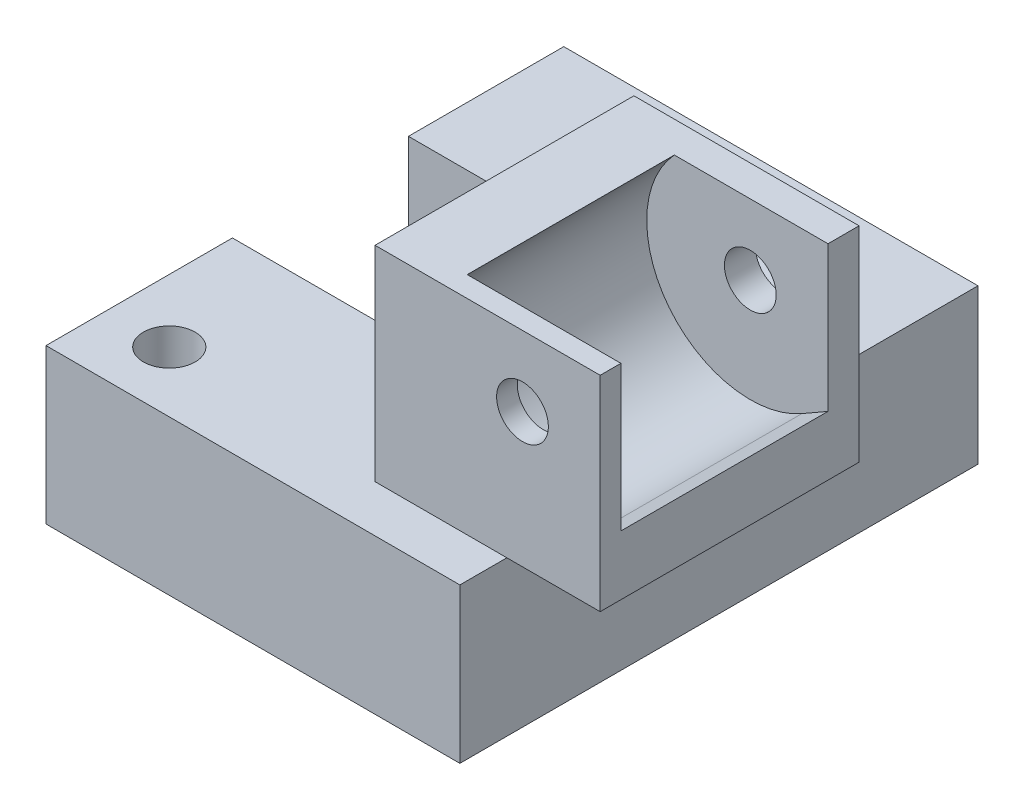
ISO-10303-21;
HEADER;
FILE_DESCRIPTION(('STEP AP214'),'2;1');
FILE_NAME('part.step','',(''),(''),'','','');
FILE_SCHEMA(('AUTOMOTIVE_DESIGN { 1 0 10303 214 1 1 1 1 }'));
ENDSEC;
DATA;
#1=APPLICATION_CONTEXT('core data for automotive mechanical design processes');
#2=APPLICATION_PROTOCOL_DEFINITION('international standard','automotive_design',2000,#1);
#3=PRODUCT_CONTEXT('',#1,'mechanical');
#4=PRODUCT('Part','Part','',(#3));
#5=PRODUCT_RELATED_PRODUCT_CATEGORY('part','',(#4));
#6=PRODUCT_DEFINITION_FORMATION('','',#4);
#7=PRODUCT_DEFINITION_CONTEXT('part definition',#1,'design');
#8=PRODUCT_DEFINITION('design','',#6,#7);
#9=PRODUCT_DEFINITION_SHAPE('','',#8);
#10=(LENGTH_UNIT() NAMED_UNIT(*) SI_UNIT(.MILLI.,.METRE.));
#11=(NAMED_UNIT(*) PLANE_ANGLE_UNIT() SI_UNIT($,.RADIAN.));
#12=(NAMED_UNIT(*) SI_UNIT($,.STERADIAN.) SOLID_ANGLE_UNIT());
#13=UNCERTAINTY_MEASURE_WITH_UNIT(LENGTH_MEASURE(1.E-05),#10,'distance_accuracy_value','');
#14=(GEOMETRIC_REPRESENTATION_CONTEXT(3) GLOBAL_UNCERTAINTY_ASSIGNED_CONTEXT((#13)) GLOBAL_UNIT_ASSIGNED_CONTEXT((#10,
#11,#12)) REPRESENTATION_CONTEXT('',''));
#15=CARTESIAN_POINT('',(0.,0.,0.));
#16=DIRECTION('',(0.,0.,1.));
#17=DIRECTION('',(1.,0.,0.));
#18=AXIS2_PLACEMENT_3D('',#15,#16,#17);
#19=CARTESIAN_POINT('',(-562.359793246241,223.218740039352,33.6602128680418));
#20=DIRECTION('',(-1.,0.,0.));
#21=DIRECTION('',(0.,-1.,0.));
#22=AXIS2_PLACEMENT_3D('',#19,#20,#21);
#23=PLANE('',#22);
#24=DIRECTION('',(0.,1.,0.));
#25=VECTOR('',#24,1.);
#26=CARTESIAN_POINT('',(-562.359793246241,304.5714,10.8002128680418));
#27=LINE('',#26,#25);
#28=CARTESIAN_POINT('',(-562.359793246241,304.5714,10.8002128680418));
#29=VERTEX_POINT('',#28);
#30=CARTESIAN_POINT('',(-562.359793246241,323.525975182462,10.8002128680418));
#31=VERTEX_POINT('',#30);
#32=EDGE_CURVE('E186',#29,#31,#27,.T.);
#33=ORIENTED_EDGE('',*,*,#32,.F.);
#34=DIRECTION('',(0.,0.,-1.));
#35=VECTOR('',#34,1.);
#36=CARTESIAN_POINT('',(-562.359793246241,304.5714,33.6602128680418));
#37=LINE('',#36,#35);
#38=CARTESIAN_POINT('',(-562.359793246241,304.5714,33.6602128680418));
#39=VERTEX_POINT('',#38);
#40=EDGE_CURVE('E185',#39,#29,#37,.T.);
#41=ORIENTED_EDGE('',*,*,#40,.F.);
#42=DIRECTION('',(0.,1.,0.));
#43=VECTOR('',#42,1.);
#44=CARTESIAN_POINT('',(-562.359793246241,223.218740039352,33.6602128680418));
#45=LINE('',#44,#43);
#46=CARTESIAN_POINT('',(-562.359793246241,323.525975182462,33.6602128680418));
#47=VERTEX_POINT('',#46);
#48=EDGE_CURVE('E227',#39,#47,#45,.T.);
#49=ORIENTED_EDGE('',*,*,#48,.T.);
#50=DIRECTION('',(0.,0.,-1.));
#51=VECTOR('',#50,1.);
#52=CARTESIAN_POINT('',(-562.359793246241,323.525975182462,33.6602128680418));
#53=LINE('',#52,#51);
#54=EDGE_CURVE('E204',#47,#31,#53,.T.);
#55=ORIENTED_EDGE('',*,*,#54,.T.);
#56=EDGE_LOOP('',(#33,#41,#49,#55));
#57=FACE_BOUND('',#56,.T.);
#58=ADVANCED_FACE('F43',(#57),#23,.T.);
#59=CARTESIAN_POINT('',(-509.64503003972,340.,27.94));
#60=DIRECTION('',(0.,0.,-1.));
#61=DIRECTION('',(1.,0.,0.));
#62=AXIS2_PLACEMENT_3D('',#59,#60,#61);
#63=CYLINDRICAL_SURFACE('',#62,12.7);
#64=CARTESIAN_POINT('',(-509.64503003972,340.,25.4000000000001));
#65=DIRECTION('',(0.,0.,-1.));
#66=DIRECTION('',(-1.,0.,0.));
#67=AXIS2_PLACEMENT_3D('',#64,#65,#66);
#68=CIRCLE('',#67,12.7);
#69=CARTESIAN_POINT('',(-503.315891549761,328.989459324133,25.4000000000001));
#70=VERTEX_POINT('',#69);
#71=CARTESIAN_POINT('',(-518.959059009132,348.633589309028,25.4000000000001));
#72=VERTEX_POINT('',#71);
#73=EDGE_CURVE('E268',#70,#72,#68,.T.);
#74=ORIENTED_EDGE('',*,*,#73,.F.);
#75=DIRECTION('',(0.,0.,-1.));
#76=VECTOR('',#75,1.);
#77=CARTESIAN_POINT('',(-503.315891549761,328.989459324133,27.94));
#78=LINE('',#77,#76);
#79=CARTESIAN_POINT('',(-503.315891549761,328.989459324133,0.));
#80=VERTEX_POINT('',#79);
#81=EDGE_CURVE('E52',#70,#80,#78,.T.);
#82=ORIENTED_EDGE('',*,*,#81,.T.);
#83=CARTESIAN_POINT('',(-509.64503003972,340.,0.));
#84=DIRECTION('',(0.,0.,1.));
#85=DIRECTION('',(1.,0.,0.));
#86=AXIS2_PLACEMENT_3D('',#83,#84,#85);
#87=CIRCLE('',#86,12.7);
#88=CARTESIAN_POINT('',(-518.959059009132,348.633589309028,0.));
#89=VERTEX_POINT('',#88);
#90=EDGE_CURVE('E279',#89,#80,#87,.T.);
#91=ORIENTED_EDGE('',*,*,#90,.F.);
#92=DIRECTION('',(0.,0.,-1.));
#93=VECTOR('',#92,1.);
#94=CARTESIAN_POINT('',(-518.959059009132,348.633589309028,27.94));
#95=LINE('',#94,#93);
#96=EDGE_CURVE('E47',#72,#89,#95,.T.);
#97=ORIENTED_EDGE('',*,*,#96,.F.);
#98=EDGE_LOOP('',(#74,#82,#91,#97));
#99=FACE_BOUND('',#98,.T.);
#100=ADVANCED_FACE('F45',(#99),#63,.F.);
#101=CARTESIAN_POINT('',(-267.1473205328,464.745153521614,27.94));
#102=DIRECTION('',(-0.498357361414056,0.866971706761195,0.));
#103=DIRECTION('',(-0.866971706761195,-0.498357361414056,0.));
#104=AXIS2_PLACEMENT_3D('',#101,#102,#103);
#105=PLANE('',#104);
#106=DIRECTION('',(0.,0.,-1.));
#107=VECTOR('',#106,1.);
#108=CARTESIAN_POINT('',(-500.115803520306,330.82895121783,27.94));
#109=LINE('',#108,#107);
#110=CARTESIAN_POINT('',(-500.115803520306,330.82895121783,25.4000000000001));
#111=VERTEX_POINT('',#110);
#112=CARTESIAN_POINT('',(-500.115803520306,330.82895121783,0.));
#113=VERTEX_POINT('',#112);
#114=EDGE_CURVE('E298',#111,#113,#109,.T.);
#115=ORIENTED_EDGE('',*,*,#114,.T.);
#116=DIRECTION('',(-0.866971706761195,-0.498357361414056,0.));
#117=VECTOR('',#116,1.);
#118=CARTESIAN_POINT('',(-267.1473205328,464.745153521614,0.));
#119=LINE('',#118,#117);
#120=EDGE_CURVE('E283',#113,#80,#119,.T.);
#121=ORIENTED_EDGE('',*,*,#120,.T.);
#122=ORIENTED_EDGE('',*,*,#81,.F.);
#123=DIRECTION('',(-0.866971706761204,-0.498357361414042,0.));
#124=VECTOR('',#123,1.);
#125=CARTESIAN_POINT('',(-500.115803520306,330.82895121783,25.4000000000001));
#126=LINE('',#125,#124);
#127=EDGE_CURVE('E271',#111,#70,#126,.T.);
#128=ORIENTED_EDGE('',*,*,#127,.F.);
#129=EDGE_LOOP('',(#115,#121,#122,#128));
#130=FACE_BOUND('',#129,.T.);
#131=ADVANCED_FACE('F350',(#130),#105,.T.);
#132=CARTESIAN_POINT('',(-500.115803520306,0.,27.94));
#133=DIRECTION('',(-1.,0.,0.));
#134=DIRECTION('',(0.,0.,-1.));
#135=AXIS2_PLACEMENT_3D('',#132,#133,#134);
#136=PLANE('',#135);
#137=ORIENTED_EDGE('',*,*,#114,.F.);
#138=DIRECTION('',(0.,-1.,0.));
#139=VECTOR('',#138,1.);
#140=CARTESIAN_POINT('',(-500.115803520306,330.82895121783,25.4000000000001));
#141=LINE('',#140,#139);
#142=CARTESIAN_POINT('',(-500.115803520306,348.633589309028,25.4000000000001));
#143=VERTEX_POINT('',#142);
#144=EDGE_CURVE('E262',#143,#111,#141,.T.);
#145=ORIENTED_EDGE('',*,*,#144,.F.);
#146=DIRECTION('',(0.,0.,-1.));
#147=VECTOR('',#146,1.);
#148=CARTESIAN_POINT('',(-500.115803520306,348.633589309028,58.7500721267847));
#149=LINE('',#148,#147);
#150=CARTESIAN_POINT('',(-500.115803520306,348.633589309028,27.94));
#151=VERTEX_POINT('',#150);
#152=EDGE_CURVE('E265',#151,#143,#149,.T.);
#153=ORIENTED_EDGE('',*,*,#152,.F.);
#154=DIRECTION('',(0.,-1.,0.));
#155=VECTOR('',#154,1.);
#156=CARTESIAN_POINT('',(-500.115803520306,0.,27.94));
#157=LINE('',#156,#155);
#158=CARTESIAN_POINT('',(-500.115803520306,323.525975182462,27.94));
#159=VERTEX_POINT('',#158);
#160=EDGE_CURVE('E290',#151,#159,#157,.T.);
#161=ORIENTED_EDGE('',*,*,#160,.T.);
#162=DIRECTION('',(0.,0.,-1.));
#163=VECTOR('',#162,1.);
#164=CARTESIAN_POINT('',(-500.115803520306,323.525975182462,27.94));
#165=LINE('',#164,#163);
#166=CARTESIAN_POINT('',(-500.115803520306,323.525975182462,-3.81));
#167=VERTEX_POINT('',#166);
#168=EDGE_CURVE('E301',#159,#167,#165,.T.);
#169=ORIENTED_EDGE('',*,*,#168,.T.);
#170=DIRECTION('',(0.,-1.,0.));
#171=VECTOR('',#170,1.);
#172=CARTESIAN_POINT('',(-500.115803520306,348.633589309028,-3.81));
#173=LINE('',#172,#171);
#174=CARTESIAN_POINT('',(-500.115803520306,348.633589309028,-3.81));
#175=VERTEX_POINT('',#174);
#176=EDGE_CURVE('E252',#175,#167,#173,.T.);
#177=ORIENTED_EDGE('',*,*,#176,.F.);
#178=DIRECTION('',(0.,0.,1.));
#179=VECTOR('',#178,1.);
#180=CARTESIAN_POINT('',(-500.115803520306,348.633589309028,-3.81));
#181=LINE('',#180,#179);
#182=CARTESIAN_POINT('',(-500.115803520306,348.633589309028,0.));
#183=VERTEX_POINT('',#182);
#184=EDGE_CURVE('E255',#175,#183,#181,.T.);
#185=ORIENTED_EDGE('',*,*,#184,.T.);
#186=DIRECTION('',(0.,-1.,0.));
#187=VECTOR('',#186,1.);
#188=CARTESIAN_POINT('',(-500.115803520306,348.633589309028,0.));
#189=LINE('',#188,#187);
#190=EDGE_CURVE('E257',#183,#113,#189,.T.);
#191=ORIENTED_EDGE('',*,*,#190,.T.);
#192=EDGE_LOOP('',(#137,#145,#153,#161,#169,#177,#185,#191));
#193=FACE_BOUND('',#192,.T.);
#194=ADVANCED_FACE('F327',(#193),#136,.F.);
#195=CARTESIAN_POINT('',(0.,323.525975182462,27.94));
#196=DIRECTION('',(0.,1.,0.));
#197=DIRECTION('',(0.,0.,-1.));
#198=AXIS2_PLACEMENT_3D('',#195,#196,#197);
#199=PLANE('',#198);
#200=DIRECTION('',(-1.,0.,0.));
#201=VECTOR('',#200,1.);
#202=CARTESIAN_POINT('',(-500.115803520306,323.525975182462,-3.81));
#203=LINE('',#202,#201);
#204=CARTESIAN_POINT('',(-511.559800437477,323.525975182462,-3.81000000000003));
#205=VERTEX_POINT('',#204);
#206=EDGE_CURVE('E243',#167,#205,#203,.T.);
#207=ORIENTED_EDGE('',*,*,#206,.F.);
#208=ORIENTED_EDGE('',*,*,#168,.F.);
#209=DIRECTION('',(-1.,0.,0.));
#210=VECTOR('',#209,1.);
#211=CARTESIAN_POINT('',(0.,323.525975182462,27.94));
#212=LINE('',#211,#210);
#213=CARTESIAN_POINT('',(-511.559809209032,323.525975182462,27.94));
#214=VERTEX_POINT('',#213);
#215=EDGE_CURVE('E287',#159,#214,#212,.T.);
#216=ORIENTED_EDGE('',*,*,#215,.T.);
#217=DIRECTION('',(-2.76269463312672E-07,0.,0.999999999999962));
#218=VECTOR('',#217,1.);
#219=CARTESIAN_POINT('',(-511.55981080102,323.525975182462,33.7024451444806));
#220=LINE('',#219,#218);
#221=EDGE_CURVE('E11',#205,#214,#220,.T.);
#222=ORIENTED_EDGE('',*,*,#221,.F.);
#223=EDGE_LOOP('',(#207,#208,#216,#222));
#224=FACE_BOUND('',#223,.T.);
#225=ADVANCED_FACE('F357',(#224),#199,.F.);
#226=CARTESIAN_POINT('',(-527.727560082314,0.,27.94));
#227=DIRECTION('',(1.,0.,0.));
#228=DIRECTION('',(0.,0.,1.));
#229=AXIS2_PLACEMENT_3D('',#226,#227,#228);
#230=PLANE('',#229);
#231=DIRECTION('',(0.,0.,-1.));
#232=VECTOR('',#231,1.);
#233=CARTESIAN_POINT('',(-527.727560082314,323.525975182462,27.94));
#234=LINE('',#233,#232);
#235=CARTESIAN_POINT('',(-527.727560082314,323.525975182462,27.94));
#236=VERTEX_POINT('',#235);
#237=CARTESIAN_POINT('',(-527.727560082314,323.525975182462,-3.81));
#238=VERTEX_POINT('',#237);
#239=EDGE_CURVE('E304',#236,#238,#234,.T.);
#240=ORIENTED_EDGE('',*,*,#239,.F.);
#241=DIRECTION('',(0.,1.,0.));
#242=VECTOR('',#241,1.);
#243=CARTESIAN_POINT('',(-527.727560082314,0.,27.94));
#244=LINE('',#243,#242);
#245=CARTESIAN_POINT('',(-527.727560082314,348.633589309028,27.94));
#246=VERTEX_POINT('',#245);
#247=EDGE_CURVE('E282',#236,#246,#244,.T.);
#248=ORIENTED_EDGE('',*,*,#247,.T.);
#249=DIRECTION('',(0.,0.,-1.));
#250=VECTOR('',#249,1.);
#251=CARTESIAN_POINT('',(-527.727560082314,348.633589309028,27.94));
#252=LINE('',#251,#250);
#253=CARTESIAN_POINT('',(-527.727560082314,348.633589309028,-3.81));
#254=VERTEX_POINT('',#253);
#255=EDGE_CURVE('E306',#246,#254,#252,.T.);
#256=ORIENTED_EDGE('',*,*,#255,.T.);
#257=DIRECTION('',(0.,1.,0.));
#258=VECTOR('',#257,1.);
#259=CARTESIAN_POINT('',(-527.727560082314,323.525975182462,-3.81));
#260=LINE('',#259,#258);
#261=EDGE_CURVE('E246',#238,#254,#260,.T.);
#262=ORIENTED_EDGE('',*,*,#261,.F.);
#263=EDGE_LOOP('',(#240,#248,#256,#262));
#264=FACE_BOUND('',#263,.T.);
#265=ADVANCED_FACE('F333',(#264),#230,.F.);
#266=CARTESIAN_POINT('',(-7.00898976020188E-13,348.633589309029,27.94));
#267=DIRECTION('',(0.,-1.,0.));
#268=DIRECTION('',(1.,0.,0.));
#269=AXIS2_PLACEMENT_3D('',#266,#267,#268);
#270=PLANE('',#269);
#271=ORIENTED_EDGE('',*,*,#255,.F.);
#272=DIRECTION('',(1.,0.,0.));
#273=VECTOR('',#272,1.);
#274=CARTESIAN_POINT('',(-7.00898976020188E-13,348.633589309029,27.94));
#275=LINE('',#274,#273);
#276=EDGE_CURVE('E280',#246,#151,#275,.T.);
#277=ORIENTED_EDGE('',*,*,#276,.T.);
#278=ORIENTED_EDGE('',*,*,#152,.T.);
#279=DIRECTION('',(1.,0.,0.));
#280=VECTOR('',#279,1.);
#281=CARTESIAN_POINT('',(-500.115803520306,348.633589309028,25.4000000000001));
#282=LINE('',#281,#280);
#283=EDGE_CURVE('E266',#72,#143,#282,.T.);
#284=ORIENTED_EDGE('',*,*,#283,.F.);
#285=ORIENTED_EDGE('',*,*,#96,.T.);
#286=DIRECTION('',(1.,0.,0.));
#287=VECTOR('',#286,1.);
#288=CARTESIAN_POINT('',(-527.727560082314,348.633589309028,0.));
#289=LINE('',#288,#287);
#290=EDGE_CURVE('E240',#89,#183,#289,.T.);
#291=ORIENTED_EDGE('',*,*,#290,.T.);
#292=ORIENTED_EDGE('',*,*,#184,.F.);
#293=DIRECTION('',(1.,0.,0.));
#294=VECTOR('',#293,1.);
#295=CARTESIAN_POINT('',(-527.727560082314,348.633589309028,-3.81));
#296=LINE('',#295,#294);
#297=EDGE_CURVE('E250',#254,#175,#296,.T.);
#298=ORIENTED_EDGE('',*,*,#297,.F.);
#299=EDGE_LOOP('',(#271,#277,#278,#284,#285,#291,#292,#298));
#300=FACE_BOUND('',#299,.T.);
#301=ADVANCED_FACE('F315',(#300),#270,.F.);
#302=CARTESIAN_POINT('',(0.,0.,27.94));
#303=DIRECTION('',(0.,0.,-1.));
#304=DIRECTION('',(1.,0.,0.));
#305=AXIS2_PLACEMENT_3D('',#302,#303,#304);
#306=PLANE('',#305);
#307=ORIENTED_EDGE('',*,*,#276,.F.);
#308=ORIENTED_EDGE('',*,*,#247,.F.);
#309=EDGE_CURVE('E286',#214,#236,#212,.T.);
#310=ORIENTED_EDGE('',*,*,#309,.F.);
#311=ORIENTED_EDGE('',*,*,#215,.F.);
#312=ORIENTED_EDGE('',*,*,#160,.F.);
#313=EDGE_LOOP('',(#307,#308,#310,#311,#312));
#314=FACE_BOUND('',#313,.T.);
#315=CARTESIAN_POINT('',(-509.64503003972,340.,27.94));
#316=DIRECTION('',(0.,0.,1.));
#317=DIRECTION('',(1.,0.,0.));
#318=AXIS2_PLACEMENT_3D('',#315,#316,#317);
#319=CIRCLE('',#318,3.1750000000002);
#320=CARTESIAN_POINT('',(-506.47003003972,340.,27.94));
#321=VERTEX_POINT('',#320);
#322=EDGE_CURVE('E264',#321,#321,#319,.T.);
#323=ORIENTED_EDGE('',*,*,#322,.F.);
#324=EDGE_LOOP('',(#323));
#325=FACE_BOUND('',#324,.T.);
#326=ADVANCED_FACE('F340',(#314,#325),#306,.F.);
#327=CARTESIAN_POINT('',(-509.64503003972,340.,25.4000000000001));
#328=DIRECTION('',(0.,0.,1.));
#329=DIRECTION('',(-1.,0.,0.));
#330=AXIS2_PLACEMENT_3D('',#327,#328,#329);
#331=PLANE('',#330);
#332=ORIENTED_EDGE('',*,*,#127,.T.);
#333=ORIENTED_EDGE('',*,*,#73,.T.);
#334=ORIENTED_EDGE('',*,*,#283,.T.);
#335=ORIENTED_EDGE('',*,*,#144,.T.);
#336=EDGE_LOOP('',(#332,#333,#334,#335));
#337=FACE_BOUND('',#336,.T.);
#338=CARTESIAN_POINT('',(-509.64503003972,340.,25.4000000000001));
#339=DIRECTION('',(0.,0.,-1.));
#340=DIRECTION('',(-1.,0.,0.));
#341=AXIS2_PLACEMENT_3D('',#338,#339,#340);
#342=CIRCLE('',#341,3.1750000000002);
#343=CARTESIAN_POINT('',(-512.82003003972,340.,25.4000000000001));
#344=VERTEX_POINT('',#343);
#345=EDGE_CURVE('E261',#344,#344,#342,.T.);
#346=ORIENTED_EDGE('',*,*,#345,.F.);
#347=EDGE_LOOP('',(#346));
#348=FACE_BOUND('',#347,.T.);
#349=ADVANCED_FACE('F347',(#337,#348),#331,.F.);
#350=CARTESIAN_POINT('',(-509.64503003972,340.,58.7500721267847));
#351=DIRECTION('',(0.,0.,-1.));
#352=DIRECTION('',(1.,0.,0.));
#353=AXIS2_PLACEMENT_3D('',#350,#351,#352);
#354=CYLINDRICAL_SURFACE('',#353,3.1750000000002);
#355=ORIENTED_EDGE('',*,*,#322,.T.);
#356=EDGE_LOOP('',(#355));
#357=FACE_BOUND('',#356,.T.);
#358=ORIENTED_EDGE('',*,*,#345,.T.);
#359=EDGE_LOOP('',(#358));
#360=FACE_BOUND('',#359,.T.);
#361=ADVANCED_FACE('F390',(#357,#360),#354,.F.);
#362=CARTESIAN_POINT('',(0.,0.,0.));
#363=DIRECTION('',(0.,0.,1.));
#364=DIRECTION('',(-1.,0.,0.));
#365=AXIS2_PLACEMENT_3D('',#362,#363,#364);
#366=PLANE('',#365);
#367=CARTESIAN_POINT('',(-509.64503003972,340.,0.));
#368=DIRECTION('',(0.,0.,1.));
#369=DIRECTION('',(1.,0.,0.));
#370=AXIS2_PLACEMENT_3D('',#367,#368,#369);
#371=CIRCLE('',#370,3.17500000000009);
#372=CARTESIAN_POINT('',(-506.47003003972,340.,0.));
#373=VERTEX_POINT('',#372);
#374=EDGE_CURVE('E218',#373,#373,#371,.T.);
#375=ORIENTED_EDGE('',*,*,#374,.F.);
#376=EDGE_LOOP('',(#375));
#377=FACE_BOUND('',#376,.T.);
#378=ORIENTED_EDGE('',*,*,#90,.T.);
#379=ORIENTED_EDGE('',*,*,#120,.F.);
#380=ORIENTED_EDGE('',*,*,#190,.F.);
#381=ORIENTED_EDGE('',*,*,#290,.F.);
#382=EDGE_LOOP('',(#378,#379,#380,#381));
#383=FACE_BOUND('',#382,.T.);
#384=ADVANCED_FACE('F323',(#377,#383),#366,.T.);
#385=CARTESIAN_POINT('',(0.,0.,-3.81));
#386=DIRECTION('',(0.,0.,1.));
#387=DIRECTION('',(-1.,0.,0.));
#388=AXIS2_PLACEMENT_3D('',#385,#386,#387);
#389=PLANE('',#388);
#390=ORIENTED_EDGE('',*,*,#206,.T.);
#391=EDGE_CURVE('E247',#205,#238,#203,.T.);
#392=ORIENTED_EDGE('',*,*,#391,.T.);
#393=ORIENTED_EDGE('',*,*,#261,.T.);
#394=ORIENTED_EDGE('',*,*,#297,.T.);
#395=ORIENTED_EDGE('',*,*,#176,.T.);
#396=EDGE_LOOP('',(#390,#392,#393,#394,#395));
#397=FACE_BOUND('',#396,.T.);
#398=CARTESIAN_POINT('',(-509.64503003972,340.,-3.81));
#399=DIRECTION('',(0.,0.,1.));
#400=DIRECTION('',(1.,0.,0.));
#401=AXIS2_PLACEMENT_3D('',#398,#399,#400);
#402=CIRCLE('',#401,3.17500000000009);
#403=CARTESIAN_POINT('',(-506.47003003972,340.,-3.81));
#404=VERTEX_POINT('',#403);
#405=EDGE_CURVE('E237',#404,#404,#402,.T.);
#406=ORIENTED_EDGE('',*,*,#405,.T.);
#407=EDGE_LOOP('',(#406));
#408=FACE_BOUND('',#407,.T.);
#409=ADVANCED_FACE('F329',(#397,#408),#389,.F.);
#410=CARTESIAN_POINT('',(-509.64503003972,340.,-3.81));
#411=DIRECTION('',(0.,0.,1.));
#412=DIRECTION('',(-1.,0.,0.));
#413=AXIS2_PLACEMENT_3D('',#410,#411,#412);
#414=CYLINDRICAL_SURFACE('',#413,3.17500000000009);
#415=ORIENTED_EDGE('',*,*,#405,.F.);
#416=EDGE_LOOP('',(#415));
#417=FACE_BOUND('',#416,.T.);
#418=ORIENTED_EDGE('',*,*,#374,.T.);
#419=EDGE_LOOP('',(#418));
#420=FACE_BOUND('',#419,.T.);
#421=ADVANCED_FACE('F370',(#417,#420),#414,.F.);
#422=DIRECTION('',(0.,1.,0.));
#423=VECTOR('',#422,1.);
#424=CARTESIAN_POINT('',(-562.359793246241,304.5714,-10.7897871319582));
#425=LINE('',#424,#423);
#426=CARTESIAN_POINT('',(-562.359793246241,304.5714,-10.7897871319582));
#427=VERTEX_POINT('',#426);
#428=CARTESIAN_POINT('',(-562.359793246241,323.525975182462,-10.7897871319582));
#429=VERTEX_POINT('',#428);
#430=EDGE_CURVE('E182',#427,#429,#425,.T.);
#431=ORIENTED_EDGE('',*,*,#430,.T.);
#432=CARTESIAN_POINT('',(-562.359793246241,323.525975182462,-29.8397871319582));
#433=VERTEX_POINT('',#432);
#434=EDGE_CURVE('E207',#429,#433,#53,.T.);
#435=ORIENTED_EDGE('',*,*,#434,.T.);
#436=DIRECTION('',(0.,1.,0.));
#437=VECTOR('',#436,1.);
#438=CARTESIAN_POINT('',(-562.359793246241,223.218740039352,-29.8397871319582));
#439=LINE('',#438,#437);
#440=CARTESIAN_POINT('',(-562.359793246241,304.5714,-29.8397871319582));
#441=VERTEX_POINT('',#440);
#442=EDGE_CURVE('E184',#441,#433,#439,.T.);
#443=ORIENTED_EDGE('',*,*,#442,.F.);
#444=EDGE_CURVE('E171',#427,#441,#37,.T.);
#445=ORIENTED_EDGE('',*,*,#444,.F.);
#446=EDGE_LOOP('',(#431,#435,#443,#445));
#447=FACE_BOUND('',#446,.T.);
#448=ADVANCED_FACE('F180',(#447),#23,.T.);
#449=CARTESIAN_POINT('',(-562.359793246241,223.218740039352,33.6602128680418));
#450=DIRECTION('',(-0.000831344024384845,0.,0.999999654433497));
#451=DIRECTION('',(-0.999999654433497,0.,-0.000831344024384845));
#452=AXIS2_PLACEMENT_3D('',#449,#450,#451);
#453=PLANE('',#452);
#454=DIRECTION('',(0.,1.,0.));
#455=VECTOR('',#454,1.);
#456=CARTESIAN_POINT('',(-511.55981080102,223.218740039352,33.7024451444805));
#457=LINE('',#456,#455);
#458=CARTESIAN_POINT('',(-511.55981080102,304.5714,33.7024451444806));
#459=VERTEX_POINT('',#458);
#460=CARTESIAN_POINT('',(-511.55981080102,323.525975182462,33.7024451444806));
#461=VERTEX_POINT('',#460);
#462=EDGE_CURVE('E222',#459,#461,#457,.T.);
#463=ORIENTED_EDGE('',*,*,#462,.T.);
#464=DIRECTION('',(-0.999999654433497,0.,-0.000831344024384845));
#465=VECTOR('',#464,1.);
#466=CARTESIAN_POINT('',(-562.359793246241,323.525975182462,33.6602128680418));
#467=LINE('',#466,#465);
#468=EDGE_CURVE('E199',#461,#47,#467,.T.);
#469=ORIENTED_EDGE('',*,*,#468,.T.);
#470=ORIENTED_EDGE('',*,*,#48,.F.);
#471=DIRECTION('',(-0.999999654433497,0.,-0.000831344024384845));
#472=VECTOR('',#471,1.);
#473=CARTESIAN_POINT('',(-562.359793246241,304.5714,33.6602128680418));
#474=LINE('',#473,#472);
#475=EDGE_CURVE('E225',#459,#39,#474,.T.);
#476=ORIENTED_EDGE('',*,*,#475,.F.);
#477=EDGE_LOOP('',(#463,#469,#470,#476));
#478=FACE_BOUND('',#477,.T.);
#479=ADVANCED_FACE('F369',(#478),#453,.T.);
#480=CARTESIAN_POINT('',(-511.55981080102,223.218740039352,33.7024451444805));
#481=DIRECTION('',(0.999999999999962,0.,2.76269463312672E-07));
#482=DIRECTION('',(-2.76269463312672E-07,0.,0.999999999999962));
#483=AXIS2_PLACEMENT_3D('',#480,#481,#482);
#484=PLANE('',#483);
#485=DIRECTION('',(0.,1.,0.));
#486=VECTOR('',#485,1.);
#487=CARTESIAN_POINT('',(-511.559793246241,223.218740039352,-29.8397871319582));
#488=LINE('',#487,#486);
#489=CARTESIAN_POINT('',(-511.559793246241,304.5714,-29.8397871319582));
#490=VERTEX_POINT('',#489);
#491=CARTESIAN_POINT('',(-511.559793246241,323.525975182462,-29.8397871319582));
#492=VERTEX_POINT('',#491);
#493=EDGE_CURVE('E212',#490,#492,#488,.T.);
#494=ORIENTED_EDGE('',*,*,#493,.T.);
#495=EDGE_CURVE('E54',#492,#205,#220,.T.);
#496=ORIENTED_EDGE('',*,*,#495,.T.);
#497=ORIENTED_EDGE('',*,*,#221,.T.);
#498=EDGE_CURVE('E55',#214,#461,#220,.T.);
#499=ORIENTED_EDGE('',*,*,#498,.T.);
#500=ORIENTED_EDGE('',*,*,#462,.F.);
#501=DIRECTION('',(-2.76269463312672E-07,0.,0.999999999999962));
#502=VECTOR('',#501,1.);
#503=CARTESIAN_POINT('',(-511.55981080102,304.5714,33.7024451444806));
#504=LINE('',#503,#502);
#505=EDGE_CURVE('E228',#490,#459,#504,.T.);
#506=ORIENTED_EDGE('',*,*,#505,.F.);
#507=EDGE_LOOP('',(#494,#496,#497,#499,#500,#506));
#508=FACE_BOUND('',#507,.T.);
#509=ADVANCED_FACE('F375',(#508),#484,.T.);
#510=CARTESIAN_POINT('',(-562.359793246241,223.218740039352,-29.8397871319582));
#511=DIRECTION('',(0.,0.,-1.));
#512=DIRECTION('',(0.,-1.,0.));
#513=AXIS2_PLACEMENT_3D('',#510,#511,#512);
#514=PLANE('',#513);
#515=ORIENTED_EDGE('',*,*,#442,.T.);
#516=DIRECTION('',(1.,0.,0.));
#517=VECTOR('',#516,1.);
#518=CARTESIAN_POINT('',(-562.359793246241,323.525975182462,-29.8397871319582));
#519=LINE('',#518,#517);
#520=EDGE_CURVE('E202',#433,#492,#519,.T.);
#521=ORIENTED_EDGE('',*,*,#520,.T.);
#522=ORIENTED_EDGE('',*,*,#493,.F.);
#523=DIRECTION('',(1.,0.,0.));
#524=VECTOR('',#523,1.);
#525=CARTESIAN_POINT('',(-562.359793246241,304.5714,-29.8397871319582));
#526=LINE('',#525,#524);
#527=EDGE_CURVE('E221',#441,#490,#526,.T.);
#528=ORIENTED_EDGE('',*,*,#527,.F.);
#529=EDGE_LOOP('',(#515,#521,#522,#528));
#530=FACE_BOUND('',#529,.T.);
#531=ADVANCED_FACE('F415',(#530),#514,.T.);
#532=CARTESIAN_POINT('',(-539.269132339574,223.218740039352,-22.1596399352954));
#533=DIRECTION('',(0.,1.,0.));
#534=DIRECTION('',(0.,0.,-1.));
#535=AXIS2_PLACEMENT_3D('',#532,#533,#534);
#536=CYLINDRICAL_SURFACE('',#535,3.17500000000008);
#537=CARTESIAN_POINT('',(-539.269132339574,323.525975182462,-22.1596399352954));
#538=DIRECTION('',(0.,-1.,0.));
#539=DIRECTION('',(0.,0.,-1.));
#540=AXIS2_PLACEMENT_3D('',#537,#538,#539);
#541=CIRCLE('',#540,3.17500000000008);
#542=CARTESIAN_POINT('',(-539.269132339574,323.525975182462,-25.3346399352955));
#543=VERTEX_POINT('',#542);
#544=EDGE_CURVE('E208',#543,#543,#541,.T.);
#545=ORIENTED_EDGE('',*,*,#544,.F.);
#546=EDGE_LOOP('',(#545));
#547=FACE_BOUND('',#546,.T.);
#548=CARTESIAN_POINT('',(-539.269132339574,304.5714,-22.1596399352954));
#549=DIRECTION('',(0.,1.,0.));
#550=DIRECTION('',(0.,0.,1.));
#551=AXIS2_PLACEMENT_3D('',#548,#549,#550);
#552=CIRCLE('',#551,3.17500000000008);
#553=CARTESIAN_POINT('',(-539.269132339574,304.5714,-18.9846399352953));
#554=VERTEX_POINT('',#553);
#555=EDGE_CURVE('E215',#554,#554,#552,.F.);
#556=ORIENTED_EDGE('',*,*,#555,.T.);
#557=EDGE_LOOP('',(#556));
#558=FACE_BOUND('',#557,.T.);
#559=ADVANCED_FACE('F447',(#547,#558),#536,.F.);
#560=CARTESIAN_POINT('',(-554.645069673997,223.218740039352,26.2575114791356));
#561=DIRECTION('',(0.,1.,0.));
#562=DIRECTION('',(0.,0.,-1.));
#563=AXIS2_PLACEMENT_3D('',#560,#561,#562);
#564=CYLINDRICAL_SURFACE('',#563,3.17500000000008);
#565=CARTESIAN_POINT('',(-554.645069673997,323.525975182462,26.2575114791357));
#566=DIRECTION('',(0.,-1.,0.));
#567=DIRECTION('',(0.,0.,-1.));
#568=AXIS2_PLACEMENT_3D('',#565,#566,#567);
#569=CIRCLE('',#568,3.17500000000008);
#570=CARTESIAN_POINT('',(-554.645069673997,323.525975182462,23.0825114791356));
#571=VERTEX_POINT('',#570);
#572=EDGE_CURVE('E211',#571,#571,#569,.T.);
#573=ORIENTED_EDGE('',*,*,#572,.F.);
#574=EDGE_LOOP('',(#573));
#575=FACE_BOUND('',#574,.T.);
#576=CARTESIAN_POINT('',(-554.645069673997,304.5714,26.2575114791357));
#577=DIRECTION('',(0.,1.,0.));
#578=DIRECTION('',(0.,0.,1.));
#579=AXIS2_PLACEMENT_3D('',#576,#577,#578);
#580=CIRCLE('',#579,3.17500000000008);
#581=CARTESIAN_POINT('',(-554.645069673997,304.5714,29.4325114791357));
#582=VERTEX_POINT('',#581);
#583=EDGE_CURVE('E200',#582,#582,#580,.F.);
#584=ORIENTED_EDGE('',*,*,#583,.T.);
#585=EDGE_LOOP('',(#584));
#586=FACE_BOUND('',#585,.T.);
#587=ADVANCED_FACE('F444',(#575,#586),#564,.F.);
#588=CARTESIAN_POINT('',(0.,323.525975182462,0.));
#589=DIRECTION('',(0.,1.,0.));
#590=DIRECTION('',(0.,0.,-1.));
#591=AXIS2_PLACEMENT_3D('',#588,#589,#590);
#592=PLANE('',#591);
#593=DIRECTION('',(-1.,0.,0.));
#594=VECTOR('',#593,1.);
#595=CARTESIAN_POINT('',(-562.359793246241,323.525975182462,10.8002128680418));
#596=LINE('',#595,#594);
#597=CARTESIAN_POINT('',(-539.499793246241,323.525975182462,10.8002128680418));
#598=VERTEX_POINT('',#597);
#599=EDGE_CURVE('E176',#598,#31,#596,.T.);
#600=ORIENTED_EDGE('',*,*,#599,.T.);
#601=ORIENTED_EDGE('',*,*,#54,.F.);
#602=ORIENTED_EDGE('',*,*,#468,.F.);
#603=ORIENTED_EDGE('',*,*,#498,.F.);
#604=ORIENTED_EDGE('',*,*,#309,.T.);
#605=ORIENTED_EDGE('',*,*,#239,.T.);
#606=ORIENTED_EDGE('',*,*,#391,.F.);
#607=ORIENTED_EDGE('',*,*,#495,.F.);
#608=ORIENTED_EDGE('',*,*,#520,.F.);
#609=ORIENTED_EDGE('',*,*,#434,.F.);
#610=DIRECTION('',(1.,0.,0.));
#611=VECTOR('',#610,1.);
#612=CARTESIAN_POINT('',(-539.499793246241,323.525975182462,-10.7897871319582));
#613=LINE('',#612,#611);
#614=CARTESIAN_POINT('',(-539.499793246241,323.525975182462,-10.7897871319582));
#615=VERTEX_POINT('',#614);
#616=EDGE_CURVE('E190',#429,#615,#613,.T.);
#617=ORIENTED_EDGE('',*,*,#616,.T.);
#618=DIRECTION('',(0.,0.,1.));
#619=VECTOR('',#618,1.);
#620=CARTESIAN_POINT('',(-539.499793246241,323.525975182462,10.8002128680418));
#621=LINE('',#620,#619);
#622=EDGE_CURVE('E426',#615,#598,#621,.T.);
#623=ORIENTED_EDGE('',*,*,#622,.T.);
#624=EDGE_LOOP('',(#600,#601,#602,#603,#604,#605,#606,#607,#608,#609,#617,#623));
#625=FACE_BOUND('',#624,.T.);
#626=ORIENTED_EDGE('',*,*,#572,.T.);
#627=EDGE_LOOP('',(#626));
#628=FACE_BOUND('',#627,.T.);
#629=ORIENTED_EDGE('',*,*,#544,.T.);
#630=EDGE_LOOP('',(#629));
#631=FACE_BOUND('',#630,.T.);
#632=ADVANCED_FACE('F334',(#625,#628,#631),#592,.T.);
#633=CARTESIAN_POINT('',(-539.269132339574,304.5714,-22.1596399352961));
#634=DIRECTION('',(0.,-1.,0.));
#635=DIRECTION('',(-0.267897982037664,0.,-0.96344728512781));
#636=AXIS2_PLACEMENT_3D('',#633,#634,#635);
#637=PLANE('',#636);
#638=DIRECTION('',(-1.,0.,0.));
#639=VECTOR('',#638,1.);
#640=CARTESIAN_POINT('',(-562.359793246241,304.5714,10.8002128680418));
#641=LINE('',#640,#639);
#642=CARTESIAN_POINT('',(-539.499793246241,304.5714,10.8002128680418));
#643=VERTEX_POINT('',#642);
#644=EDGE_CURVE('E192',#643,#29,#641,.T.);
#645=ORIENTED_EDGE('',*,*,#644,.F.);
#646=DIRECTION('',(0.,0.,1.));
#647=VECTOR('',#646,1.);
#648=CARTESIAN_POINT('',(-539.499793246241,304.5714,10.8002128680418));
#649=LINE('',#648,#647);
#650=CARTESIAN_POINT('',(-539.499793246241,304.5714,-10.7897871319582));
#651=VERTEX_POINT('',#650);
#652=EDGE_CURVE('E173',#651,#643,#649,.T.);
#653=ORIENTED_EDGE('',*,*,#652,.F.);
#654=DIRECTION('',(1.,0.,0.));
#655=VECTOR('',#654,1.);
#656=CARTESIAN_POINT('',(-539.499793246241,304.5714,-10.7897871319582));
#657=LINE('',#656,#655);
#658=EDGE_CURVE('E166',#427,#651,#657,.T.);
#659=ORIENTED_EDGE('',*,*,#658,.F.);
#660=ORIENTED_EDGE('',*,*,#444,.T.);
#661=ORIENTED_EDGE('',*,*,#527,.T.);
#662=ORIENTED_EDGE('',*,*,#505,.T.);
#663=ORIENTED_EDGE('',*,*,#475,.T.);
#664=ORIENTED_EDGE('',*,*,#40,.T.);
#665=EDGE_LOOP('',(#645,#653,#659,#660,#661,#662,#663,#664));
#666=FACE_BOUND('',#665,.T.);
#667=ORIENTED_EDGE('',*,*,#583,.F.);
#668=EDGE_LOOP('',(#667));
#669=FACE_BOUND('',#668,.T.);
#670=ORIENTED_EDGE('',*,*,#555,.F.);
#671=EDGE_LOOP('',(#670));
#672=FACE_BOUND('',#671,.T.);
#673=ADVANCED_FACE('F169',(#666,#669,#672),#637,.T.);
#674=CARTESIAN_POINT('',(-562.359793246241,304.5714,10.8002128680418));
#675=DIRECTION('',(0.,0.,1.));
#676=DIRECTION('',(-1.,0.,0.));
#677=AXIS2_PLACEMENT_3D('',#674,#675,#676);
#678=PLANE('',#677);
#679=ORIENTED_EDGE('',*,*,#599,.F.);
#680=DIRECTION('',(0.,1.,0.));
#681=VECTOR('',#680,1.);
#682=CARTESIAN_POINT('',(-539.499793246241,304.5714,10.8002128680418));
#683=LINE('',#682,#681);
#684=EDGE_CURVE('E194',#643,#598,#683,.T.);
#685=ORIENTED_EDGE('',*,*,#684,.F.);
#686=ORIENTED_EDGE('',*,*,#644,.T.);
#687=ORIENTED_EDGE('',*,*,#32,.T.);
#688=EDGE_LOOP('',(#679,#685,#686,#687));
#689=FACE_BOUND('',#688,.T.);
#690=ADVANCED_FACE('F431',(#689),#678,.F.);
#691=CARTESIAN_POINT('',(-539.499793246241,304.5714,10.8002128680418));
#692=DIRECTION('',(1.,0.,0.));
#693=DIRECTION('',(0.,0.,1.));
#694=AXIS2_PLACEMENT_3D('',#691,#692,#693);
#695=PLANE('',#694);
#696=ORIENTED_EDGE('',*,*,#622,.F.);
#697=DIRECTION('',(0.,1.,0.));
#698=VECTOR('',#697,1.);
#699=CARTESIAN_POINT('',(-539.499793246241,304.5714,-10.7897871319582));
#700=LINE('',#699,#698);
#701=EDGE_CURVE('E62',#651,#615,#700,.T.);
#702=ORIENTED_EDGE('',*,*,#701,.F.);
#703=ORIENTED_EDGE('',*,*,#652,.T.);
#704=ORIENTED_EDGE('',*,*,#684,.T.);
#705=EDGE_LOOP('',(#696,#702,#703,#704));
#706=FACE_BOUND('',#705,.T.);
#707=ADVANCED_FACE('F430',(#706),#695,.F.);
#708=CARTESIAN_POINT('',(-539.499793246241,304.5714,-10.7897871319582));
#709=DIRECTION('',(0.,0.,-1.));
#710=DIRECTION('',(1.,0.,0.));
#711=AXIS2_PLACEMENT_3D('',#708,#709,#710);
#712=PLANE('',#711);
#713=ORIENTED_EDGE('',*,*,#616,.F.);
#714=ORIENTED_EDGE('',*,*,#430,.F.);
#715=ORIENTED_EDGE('',*,*,#658,.T.);
#716=ORIENTED_EDGE('',*,*,#701,.T.);
#717=EDGE_LOOP('',(#713,#714,#715,#716));
#718=FACE_BOUND('',#717,.T.);
#719=ADVANCED_FACE('F188',(#718),#712,.F.);
#720=CLOSED_SHELL('',(#58,#100,#131,#194,#225,#265,#301,#326,#349,#361,#384,#409,#421,#448,#479,
#509,#531,#559,#587,#632,#673,#690,#707,#719));
#721=MANIFOLD_SOLID_BREP('B2',#720);
#722=ADVANCED_BREP_SHAPE_REPRESENTATION('',(#18,#721),#14);
#723=SHAPE_DEFINITION_REPRESENTATION(#9,#722);
ENDSEC;
END-ISO-10303-21;
